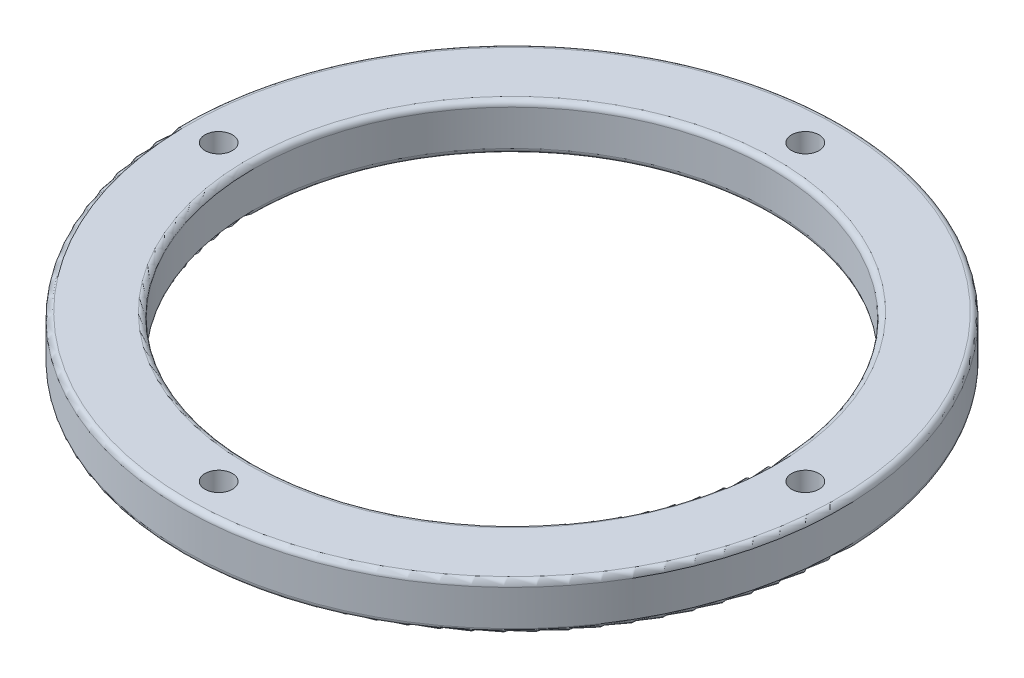
ISO-10303-21;
HEADER;
FILE_DESCRIPTION(('STEP AP214'),'2;1');
FILE_NAME('part.step','',(''),(''),'','','');
FILE_SCHEMA(('AUTOMOTIVE_DESIGN { 1 0 10303 214 1 1 1 1 }'));
ENDSEC;
DATA;
#1=APPLICATION_CONTEXT('core data for automotive mechanical design processes');
#2=APPLICATION_PROTOCOL_DEFINITION('international standard','automotive_design',2000,#1);
#3=PRODUCT_CONTEXT('',#1,'mechanical');
#4=PRODUCT('Part','Part','',(#3));
#5=PRODUCT_RELATED_PRODUCT_CATEGORY('part','',(#4));
#6=PRODUCT_DEFINITION_FORMATION('','',#4);
#7=PRODUCT_DEFINITION_CONTEXT('part definition',#1,'design');
#8=PRODUCT_DEFINITION('design','',#6,#7);
#9=PRODUCT_DEFINITION_SHAPE('','',#8);
#10=(LENGTH_UNIT() NAMED_UNIT(*) SI_UNIT(.MILLI.,.METRE.));
#11=(NAMED_UNIT(*) PLANE_ANGLE_UNIT() SI_UNIT($,.RADIAN.));
#12=(NAMED_UNIT(*) SI_UNIT($,.STERADIAN.) SOLID_ANGLE_UNIT());
#13=UNCERTAINTY_MEASURE_WITH_UNIT(LENGTH_MEASURE(1.E-05),#10,'distance_accuracy_value','');
#14=(GEOMETRIC_REPRESENTATION_CONTEXT(3) GLOBAL_UNCERTAINTY_ASSIGNED_CONTEXT((#13)) GLOBAL_UNIT_ASSIGNED_CONTEXT((#10,
#11,#12)) REPRESENTATION_CONTEXT('',''));
#15=CARTESIAN_POINT('',(0.,0.,0.));
#16=DIRECTION('',(0.,0.,1.));
#17=DIRECTION('',(1.,0.,0.));
#18=AXIS2_PLACEMENT_3D('',#15,#16,#17);
#19=CARTESIAN_POINT('',(0.,8.5,0.));
#20=DIRECTION('',(0.,1.,0.));
#21=DIRECTION('',(0.,0.,1.));
#22=AXIS2_PLACEMENT_3D('',#19,#20,#21);
#23=PLANE('',#22);
#24=CARTESIAN_POINT('',(0.,8.5,0.));
#25=DIRECTION('',(0.,1.,0.));
#26=DIRECTION('',(0.,0.,1.));
#27=AXIS2_PLACEMENT_3D('',#24,#25,#26);
#28=CIRCLE('',#27,48.1);
#29=CARTESIAN_POINT('',(0.,8.5,48.1));
#30=VERTEX_POINT('',#29);
#31=EDGE_CURVE('E42',#30,#30,#28,.F.);
#32=ORIENTED_EDGE('',*,*,#31,.T.);
#33=EDGE_LOOP('',(#32));
#34=FACE_BOUND('',#33,.T.);
#35=CARTESIAN_POINT('',(0.,8.5,0.));
#36=DIRECTION('',(0.,1.,0.));
#37=DIRECTION('',(0.,0.,1.));
#38=AXIS2_PLACEMENT_3D('',#35,#36,#37);
#39=CIRCLE('',#38,59.);
#40=CARTESIAN_POINT('',(0.,8.5,59.));
#41=VERTEX_POINT('',#40);
#42=EDGE_CURVE('E46',#41,#41,#39,.T.);
#43=ORIENTED_EDGE('',*,*,#42,.T.);
#44=EDGE_LOOP('',(#43));
#45=FACE_BOUND('',#44,.T.);
#46=CARTESIAN_POINT('',(0.,8.5,53.4));
#47=DIRECTION('',(0.,1.,0.));
#48=DIRECTION('',(0.,0.,1.));
#49=AXIS2_PLACEMENT_3D('',#46,#47,#48);
#50=CIRCLE('',#49,2.5);
#51=CARTESIAN_POINT('',(0.,8.5,55.9));
#52=VERTEX_POINT('',#51);
#53=EDGE_CURVE('E73',#52,#52,#50,.T.);
#54=ORIENTED_EDGE('',*,*,#53,.F.);
#55=EDGE_LOOP('',(#54));
#56=FACE_BOUND('',#55,.T.);
#57=CARTESIAN_POINT('',(0.,8.5,-53.4));
#58=DIRECTION('',(0.,1.,0.));
#59=DIRECTION('',(0.,0.,1.));
#60=AXIS2_PLACEMENT_3D('',#57,#58,#59);
#61=CIRCLE('',#60,2.5);
#62=CARTESIAN_POINT('',(0.,8.5,-50.9));
#63=VERTEX_POINT('',#62);
#64=EDGE_CURVE('E63',#63,#63,#61,.T.);
#65=ORIENTED_EDGE('',*,*,#64,.F.);
#66=EDGE_LOOP('',(#65));
#67=FACE_BOUND('',#66,.T.);
#68=CARTESIAN_POINT('',(53.4,8.5,0.));
#69=DIRECTION('',(0.,1.,0.));
#70=DIRECTION('',(0.,0.,1.));
#71=AXIS2_PLACEMENT_3D('',#68,#69,#70);
#72=CIRCLE('',#71,2.50000000000019);
#73=CARTESIAN_POINT('',(53.4,8.5,2.50000000000018));
#74=VERTEX_POINT('',#73);
#75=EDGE_CURVE('E67',#74,#74,#72,.T.);
#76=ORIENTED_EDGE('',*,*,#75,.F.);
#77=EDGE_LOOP('',(#76));
#78=FACE_BOUND('',#77,.T.);
#79=CARTESIAN_POINT('',(-53.4,8.5,0.));
#80=DIRECTION('',(0.,1.,0.));
#81=DIRECTION('',(0.,0.,1.));
#82=AXIS2_PLACEMENT_3D('',#79,#80,#81);
#83=CIRCLE('',#82,2.5);
#84=CARTESIAN_POINT('',(-53.4,8.5,2.5));
#85=VERTEX_POINT('',#84);
#86=EDGE_CURVE('E79',#85,#85,#83,.T.);
#87=ORIENTED_EDGE('',*,*,#86,.F.);
#88=EDGE_LOOP('',(#87));
#89=FACE_BOUND('',#88,.T.);
#90=ADVANCED_FACE('F31',(#34,#45,#56,#67,#78,#89),#23,.T.);
#91=CARTESIAN_POINT('',(0.,0.,0.));
#92=DIRECTION('',(0.,1.,0.));
#93=DIRECTION('',(0.,0.,1.));
#94=AXIS2_PLACEMENT_3D('',#91,#92,#93);
#95=PLANE('',#94);
#96=CARTESIAN_POINT('',(0.,0.,0.));
#97=DIRECTION('',(0.,1.,0.));
#98=DIRECTION('',(0.,0.,1.));
#99=AXIS2_PLACEMENT_3D('',#96,#97,#98);
#100=CIRCLE('',#99,48.1);
#101=CARTESIAN_POINT('',(0.,0.,48.1));
#102=VERTEX_POINT('',#101);
#103=EDGE_CURVE('E57',#102,#102,#100,.T.);
#104=ORIENTED_EDGE('',*,*,#103,.T.);
#105=EDGE_LOOP('',(#104));
#106=FACE_BOUND('',#105,.T.);
#107=CARTESIAN_POINT('',(0.,0.,0.));
#108=DIRECTION('',(0.,1.,0.));
#109=DIRECTION('',(0.,0.,1.));
#110=AXIS2_PLACEMENT_3D('',#107,#108,#109);
#111=CIRCLE('',#110,59.);
#112=CARTESIAN_POINT('',(0.,0.,59.));
#113=VERTEX_POINT('',#112);
#114=EDGE_CURVE('E60',#113,#113,#111,.F.);
#115=ORIENTED_EDGE('',*,*,#114,.T.);
#116=EDGE_LOOP('',(#115));
#117=FACE_BOUND('',#116,.T.);
#118=CARTESIAN_POINT('',(0.,0.,-53.4));
#119=DIRECTION('',(0.,1.,0.));
#120=DIRECTION('',(0.,0.,1.));
#121=AXIS2_PLACEMENT_3D('',#118,#119,#120);
#122=CIRCLE('',#121,2.5);
#123=CARTESIAN_POINT('',(0.,0.,-50.9));
#124=VERTEX_POINT('',#123);
#125=EDGE_CURVE('E64',#124,#124,#122,.T.);
#126=ORIENTED_EDGE('',*,*,#125,.T.);
#127=EDGE_LOOP('',(#126));
#128=FACE_BOUND('',#127,.T.);
#129=CARTESIAN_POINT('',(53.4,0.,0.));
#130=DIRECTION('',(0.,1.,0.));
#131=DIRECTION('',(0.,0.,1.));
#132=AXIS2_PLACEMENT_3D('',#129,#130,#131);
#133=CIRCLE('',#132,2.50000000000019);
#134=CARTESIAN_POINT('',(53.4,0.,2.50000000000018));
#135=VERTEX_POINT('',#134);
#136=EDGE_CURVE('E70',#135,#135,#133,.T.);
#137=ORIENTED_EDGE('',*,*,#136,.T.);
#138=EDGE_LOOP('',(#137));
#139=FACE_BOUND('',#138,.T.);
#140=CARTESIAN_POINT('',(0.,0.,53.4));
#141=DIRECTION('',(0.,1.,0.));
#142=DIRECTION('',(0.,0.,1.));
#143=AXIS2_PLACEMENT_3D('',#140,#141,#142);
#144=CIRCLE('',#143,2.5);
#145=CARTESIAN_POINT('',(0.,0.,55.9));
#146=VERTEX_POINT('',#145);
#147=EDGE_CURVE('E76',#146,#146,#144,.T.);
#148=ORIENTED_EDGE('',*,*,#147,.T.);
#149=EDGE_LOOP('',(#148));
#150=FACE_BOUND('',#149,.T.);
#151=CARTESIAN_POINT('',(-53.4,0.,0.));
#152=DIRECTION('',(0.,1.,0.));
#153=DIRECTION('',(0.,0.,1.));
#154=AXIS2_PLACEMENT_3D('',#151,#152,#153);
#155=CIRCLE('',#154,2.5);
#156=CARTESIAN_POINT('',(-53.4,0.,2.5));
#157=VERTEX_POINT('',#156);
#158=EDGE_CURVE('E82',#157,#157,#155,.T.);
#159=ORIENTED_EDGE('',*,*,#158,.T.);
#160=EDGE_LOOP('',(#159));
#161=FACE_BOUND('',#160,.T.);
#162=ADVANCED_FACE('F92',(#106,#117,#128,#139,#150,#161),#95,.F.);
#163=CARTESIAN_POINT('',(0.,8.5,0.));
#164=DIRECTION('',(0.,-1.,0.));
#165=DIRECTION('',(0.,0.,-1.));
#166=AXIS2_PLACEMENT_3D('',#163,#164,#165);
#167=CYLINDRICAL_SURFACE('',#166,60.);
#168=CARTESIAN_POINT('',(0.,1.,0.));
#169=DIRECTION('',(0.,1.,0.));
#170=DIRECTION('',(0.,0.,1.));
#171=AXIS2_PLACEMENT_3D('',#168,#169,#170);
#172=CIRCLE('',#171,60.);
#173=CARTESIAN_POINT('',(0.,1.,60.));
#174=VERTEX_POINT('',#173);
#175=EDGE_CURVE('E10',#174,#174,#172,.T.);
#176=ORIENTED_EDGE('',*,*,#175,.T.);
#177=EDGE_LOOP('',(#176));
#178=FACE_BOUND('',#177,.T.);
#179=CARTESIAN_POINT('',(0.,7.5,0.));
#180=DIRECTION('',(0.,1.,0.));
#181=DIRECTION('',(0.,0.,1.));
#182=AXIS2_PLACEMENT_3D('',#179,#180,#181);
#183=CIRCLE('',#182,60.);
#184=CARTESIAN_POINT('',(0.,7.5,60.));
#185=VERTEX_POINT('',#184);
#186=EDGE_CURVE('E38',#185,#185,#183,.F.);
#187=ORIENTED_EDGE('',*,*,#186,.T.);
#188=EDGE_LOOP('',(#187));
#189=FACE_BOUND('',#188,.T.);
#190=ADVANCED_FACE('F98',(#178,#189),#167,.T.);
#191=CARTESIAN_POINT('',(0.,8.5,0.));
#192=DIRECTION('',(0.,-1.,0.));
#193=DIRECTION('',(0.,0.,-1.));
#194=AXIS2_PLACEMENT_3D('',#191,#192,#193);
#195=CYLINDRICAL_SURFACE('',#194,47.1);
#196=CARTESIAN_POINT('',(0.,1.,0.));
#197=DIRECTION('',(0.,1.,0.));
#198=DIRECTION('',(0.,0.,1.));
#199=AXIS2_PLACEMENT_3D('',#196,#197,#198);
#200=CIRCLE('',#199,47.1);
#201=CARTESIAN_POINT('',(0.,1.,47.1));
#202=VERTEX_POINT('',#201);
#203=EDGE_CURVE('E51',#202,#202,#200,.F.);
#204=ORIENTED_EDGE('',*,*,#203,.T.);
#205=EDGE_LOOP('',(#204));
#206=FACE_BOUND('',#205,.T.);
#207=CARTESIAN_POINT('',(0.,7.5,0.));
#208=DIRECTION('',(0.,1.,0.));
#209=DIRECTION('',(0.,0.,1.));
#210=AXIS2_PLACEMENT_3D('',#207,#208,#209);
#211=CIRCLE('',#210,47.1);
#212=CARTESIAN_POINT('',(0.,7.5,47.1));
#213=VERTEX_POINT('',#212);
#214=EDGE_CURVE('E54',#213,#213,#211,.T.);
#215=ORIENTED_EDGE('',*,*,#214,.T.);
#216=EDGE_LOOP('',(#215));
#217=FACE_BOUND('',#216,.T.);
#218=ADVANCED_FACE('F103',(#206,#217),#195,.F.);
#219=CARTESIAN_POINT('',(0.,8.5,-53.4));
#220=DIRECTION('',(0.,-1.,0.));
#221=DIRECTION('',(0.,0.,-1.));
#222=AXIS2_PLACEMENT_3D('',#219,#220,#221);
#223=CYLINDRICAL_SURFACE('',#222,2.5);
#224=ORIENTED_EDGE('',*,*,#64,.T.);
#225=EDGE_LOOP('',(#224));
#226=FACE_BOUND('',#225,.T.);
#227=ORIENTED_EDGE('',*,*,#125,.F.);
#228=EDGE_LOOP('',(#227));
#229=FACE_BOUND('',#228,.T.);
#230=ADVANCED_FACE('F144',(#226,#229),#223,.F.);
#231=CARTESIAN_POINT('',(53.4,8.5,0.));
#232=DIRECTION('',(0.,-1.,0.));
#233=DIRECTION('',(0.,0.,-1.));
#234=AXIS2_PLACEMENT_3D('',#231,#232,#233);
#235=CYLINDRICAL_SURFACE('',#234,2.50000000000019);
#236=ORIENTED_EDGE('',*,*,#75,.T.);
#237=EDGE_LOOP('',(#236));
#238=FACE_BOUND('',#237,.T.);
#239=ORIENTED_EDGE('',*,*,#136,.F.);
#240=EDGE_LOOP('',(#239));
#241=FACE_BOUND('',#240,.T.);
#242=ADVANCED_FACE('F139',(#238,#241),#235,.F.);
#243=CARTESIAN_POINT('',(0.,8.5,53.4));
#244=DIRECTION('',(0.,-1.,0.));
#245=DIRECTION('',(0.,0.,-1.));
#246=AXIS2_PLACEMENT_3D('',#243,#244,#245);
#247=CYLINDRICAL_SURFACE('',#246,2.5);
#248=ORIENTED_EDGE('',*,*,#53,.T.);
#249=EDGE_LOOP('',(#248));
#250=FACE_BOUND('',#249,.T.);
#251=ORIENTED_EDGE('',*,*,#147,.F.);
#252=EDGE_LOOP('',(#251));
#253=FACE_BOUND('',#252,.T.);
#254=ADVANCED_FACE('F134',(#250,#253),#247,.F.);
#255=CARTESIAN_POINT('',(-53.4,8.5,0.));
#256=DIRECTION('',(0.,-1.,0.));
#257=DIRECTION('',(0.,0.,-1.));
#258=AXIS2_PLACEMENT_3D('',#255,#256,#257);
#259=CYLINDRICAL_SURFACE('',#258,2.5);
#260=ORIENTED_EDGE('',*,*,#86,.T.);
#261=EDGE_LOOP('',(#260));
#262=FACE_BOUND('',#261,.T.);
#263=ORIENTED_EDGE('',*,*,#158,.F.);
#264=EDGE_LOOP('',(#263));
#265=FACE_BOUND('',#264,.T.);
#266=ADVANCED_FACE('F88',(#262,#265),#259,.F.);
#267=CARTESIAN_POINT('',(0.,1.,0.));
#268=DIRECTION('',(0.,1.,0.));
#269=DIRECTION('',(0.,0.,1.));
#270=AXIS2_PLACEMENT_3D('',#267,#268,#269);
#271=TOROIDAL_SURFACE('',#270,48.1,1.);
#272=ORIENTED_EDGE('',*,*,#203,.F.);
#273=EDGE_LOOP('',(#272));
#274=FACE_BOUND('',#273,.T.);
#275=ORIENTED_EDGE('',*,*,#103,.F.);
#276=EDGE_LOOP('',(#275));
#277=FACE_BOUND('',#276,.T.);
#278=ADVANCED_FACE('F108',(#274,#277),#271,.T.);
#279=CARTESIAN_POINT('',(0.,7.5,0.));
#280=DIRECTION('',(0.,1.,0.));
#281=DIRECTION('',(0.,0.,1.));
#282=AXIS2_PLACEMENT_3D('',#279,#280,#281);
#283=TOROIDAL_SURFACE('',#282,48.1,1.);
#284=ORIENTED_EDGE('',*,*,#31,.F.);
#285=EDGE_LOOP('',(#284));
#286=FACE_BOUND('',#285,.T.);
#287=ORIENTED_EDGE('',*,*,#214,.F.);
#288=EDGE_LOOP('',(#287));
#289=FACE_BOUND('',#288,.T.);
#290=ADVANCED_FACE('F111',(#286,#289),#283,.T.);
#291=CARTESIAN_POINT('',(0.,1.,0.));
#292=DIRECTION('',(0.,1.,0.));
#293=DIRECTION('',(0.,0.,1.));
#294=AXIS2_PLACEMENT_3D('',#291,#292,#293);
#295=TOROIDAL_SURFACE('',#294,59.,1.);
#296=ORIENTED_EDGE('',*,*,#114,.F.);
#297=EDGE_LOOP('',(#296));
#298=FACE_BOUND('',#297,.T.);
#299=ORIENTED_EDGE('',*,*,#175,.F.);
#300=EDGE_LOOP('',(#299));
#301=FACE_BOUND('',#300,.T.);
#302=ADVANCED_FACE('F114',(#298,#301),#295,.T.);
#303=CARTESIAN_POINT('',(0.,7.5,0.));
#304=DIRECTION('',(0.,1.,0.));
#305=DIRECTION('',(0.,0.,1.));
#306=AXIS2_PLACEMENT_3D('',#303,#304,#305);
#307=TOROIDAL_SURFACE('',#306,59.,1.);
#308=ORIENTED_EDGE('',*,*,#186,.F.);
#309=EDGE_LOOP('',(#308));
#310=FACE_BOUND('',#309,.T.);
#311=ORIENTED_EDGE('',*,*,#42,.F.);
#312=EDGE_LOOP('',(#311));
#313=FACE_BOUND('',#312,.T.);
#314=ADVANCED_FACE('F33',(#310,#313),#307,.T.);
#315=CLOSED_SHELL('',(#90,#162,#190,#218,#230,#242,#254,#266,#278,#290,#302,#314));
#316=MANIFOLD_SOLID_BREP('B2',#315);
#317=ADVANCED_BREP_SHAPE_REPRESENTATION('',(#18,#316),#14);
#318=SHAPE_DEFINITION_REPRESENTATION(#9,#317);
ENDSEC;
END-ISO-10303-21;
